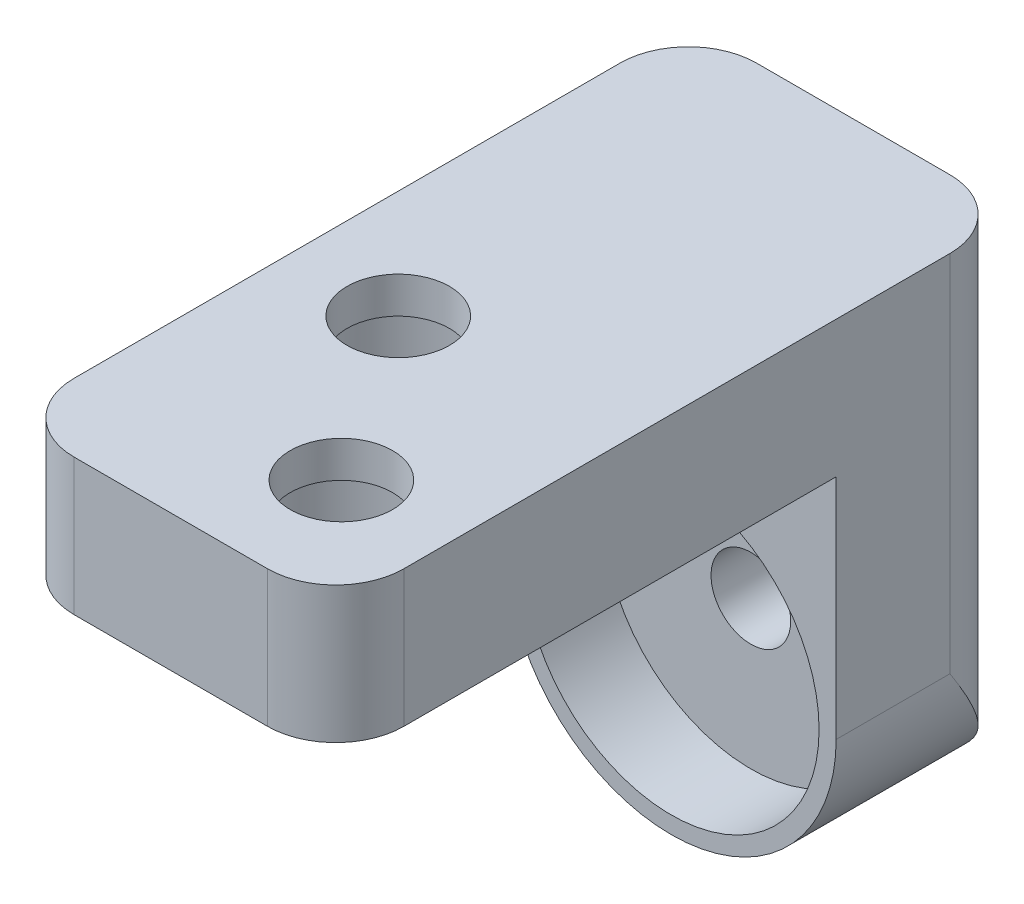
ISO-10303-21;
HEADER;
FILE_DESCRIPTION(('STEP AP214'),'2;1');
FILE_NAME('part.step','',(''),(''),'','','');
FILE_SCHEMA(('AUTOMOTIVE_DESIGN { 1 0 10303 214 1 1 1 1 }'));
ENDSEC;
DATA;
#1=APPLICATION_CONTEXT('core data for automotive mechanical design processes');
#2=APPLICATION_PROTOCOL_DEFINITION('international standard','automotive_design',2000,#1);
#3=PRODUCT_CONTEXT('',#1,'mechanical');
#4=PRODUCT('Part','Part','',(#3));
#5=PRODUCT_RELATED_PRODUCT_CATEGORY('part','',(#4));
#6=PRODUCT_DEFINITION_FORMATION('','',#4);
#7=PRODUCT_DEFINITION_CONTEXT('part definition',#1,'design');
#8=PRODUCT_DEFINITION('design','',#6,#7);
#9=PRODUCT_DEFINITION_SHAPE('','',#8);
#10=(LENGTH_UNIT() NAMED_UNIT(*) SI_UNIT(.MILLI.,.METRE.));
#11=(NAMED_UNIT(*) PLANE_ANGLE_UNIT() SI_UNIT($,.RADIAN.));
#12=(NAMED_UNIT(*) SI_UNIT($,.STERADIAN.) SOLID_ANGLE_UNIT());
#13=UNCERTAINTY_MEASURE_WITH_UNIT(LENGTH_MEASURE(1.E-05),#10,'distance_accuracy_value','');
#14=(GEOMETRIC_REPRESENTATION_CONTEXT(3) GLOBAL_UNCERTAINTY_ASSIGNED_CONTEXT((#13)) GLOBAL_UNIT_ASSIGNED_CONTEXT((#10,
#11,#12)) REPRESENTATION_CONTEXT('',''));
#15=CARTESIAN_POINT('',(0.,0.,0.));
#16=DIRECTION('',(0.,0.,1.));
#17=DIRECTION('',(1.,0.,0.));
#18=AXIS2_PLACEMENT_3D('',#15,#16,#17);
#19=CARTESIAN_POINT('',(0.,0.,30.));
#20=DIRECTION('',(1.,0.,0.));
#21=DIRECTION('',(0.,0.,-1.));
#22=AXIS2_PLACEMENT_3D('',#19,#20,#21);
#23=PLANE('',#22);
#24=DIRECTION('',(0.,0.,1.));
#25=VECTOR('',#24,1.);
#26=CARTESIAN_POINT('',(0.,17.25,30.));
#27=LINE('',#26,#25);
#28=CARTESIAN_POINT('',(0.,17.25,8.));
#29=VERTEX_POINT('',#28);
#30=CARTESIAN_POINT('',(0.,17.25,27.));
#31=VERTEX_POINT('',#30);
#32=EDGE_CURVE('E293',#29,#31,#27,.T.);
#33=ORIENTED_EDGE('',*,*,#32,.T.);
#34=DIRECTION('',(0.,1.,0.));
#35=VECTOR('',#34,1.);
#36=CARTESIAN_POINT('',(0.,0.,27.));
#37=LINE('',#36,#35);
#38=CARTESIAN_POINT('',(0.,23.25,27.));
#39=VERTEX_POINT('',#38);
#40=EDGE_CURVE('E57',#31,#39,#37,.T.);
#41=ORIENTED_EDGE('',*,*,#40,.T.);
#42=DIRECTION('',(0.,0.,-1.));
#43=VECTOR('',#42,1.);
#44=CARTESIAN_POINT('',(0.,23.25,30.));
#45=LINE('',#44,#43);
#46=CARTESIAN_POINT('',(0.,23.25,3.00000000000002));
#47=VERTEX_POINT('',#46);
#48=EDGE_CURVE('E161',#39,#47,#45,.T.);
#49=ORIENTED_EDGE('',*,*,#48,.T.);
#50=DIRECTION('',(0.,1.,0.));
#51=VECTOR('',#50,1.);
#52=CARTESIAN_POINT('',(0.,0.,3.00000000000002));
#53=LINE('',#52,#51);
#54=CARTESIAN_POINT('',(0.,7.25,3.00000000000002));
#55=VERTEX_POINT('',#54);
#56=EDGE_CURVE('E390',#55,#47,#53,.T.);
#57=ORIENTED_EDGE('',*,*,#56,.F.);
#58=DIRECTION('',(0.,0.,-1.));
#59=VECTOR('',#58,1.);
#60=CARTESIAN_POINT('',(0.,7.25,30.));
#61=LINE('',#60,#59);
#62=CARTESIAN_POINT('',(0.,7.25,8.));
#63=VERTEX_POINT('',#62);
#64=EDGE_CURVE('E194',#55,#63,#61,.F.);
#65=ORIENTED_EDGE('',*,*,#64,.T.);
#66=DIRECTION('',(0.,1.,0.));
#67=VECTOR('',#66,1.);
#68=CARTESIAN_POINT('',(0.,0.,8.));
#69=LINE('',#68,#67);
#70=EDGE_CURVE('E295',#63,#29,#69,.T.);
#71=ORIENTED_EDGE('',*,*,#70,.T.);
#72=EDGE_LOOP('',(#33,#41,#49,#57,#65,#71));
#73=FACE_BOUND('',#72,.T.);
#74=ADVANCED_FACE('F42',(#73),#23,.F.);
#75=CARTESIAN_POINT('',(14.5,0.,30.));
#76=DIRECTION('',(-1.,0.,0.));
#77=DIRECTION('',(0.,0.,1.));
#78=AXIS2_PLACEMENT_3D('',#75,#76,#77);
#79=PLANE('',#78);
#80=DIRECTION('',(0.,0.,-1.));
#81=VECTOR('',#80,1.);
#82=CARTESIAN_POINT('',(14.5,7.25,30.));
#83=LINE('',#82,#81);
#84=CARTESIAN_POINT('',(14.5,7.25,8.));
#85=VERTEX_POINT('',#84);
#86=CARTESIAN_POINT('',(14.5,7.25,3.00000000000002));
#87=VERTEX_POINT('',#86);
#88=EDGE_CURVE('E177',#85,#87,#83,.T.);
#89=ORIENTED_EDGE('',*,*,#88,.T.);
#90=DIRECTION('',(0.,1.,0.));
#91=VECTOR('',#90,1.);
#92=CARTESIAN_POINT('',(14.5,0.,3.00000000000002));
#93=LINE('',#92,#91);
#94=CARTESIAN_POINT('',(14.5,23.25,3.00000000000002));
#95=VERTEX_POINT('',#94);
#96=EDGE_CURVE('E316',#87,#95,#93,.T.);
#97=ORIENTED_EDGE('',*,*,#96,.T.);
#98=DIRECTION('',(0.,0.,-1.));
#99=VECTOR('',#98,1.);
#100=CARTESIAN_POINT('',(14.5,23.25,30.));
#101=LINE('',#100,#99);
#102=CARTESIAN_POINT('',(14.5,23.25,27.));
#103=VERTEX_POINT('',#102);
#104=EDGE_CURVE('E166',#103,#95,#101,.T.);
#105=ORIENTED_EDGE('',*,*,#104,.F.);
#106=DIRECTION('',(0.,1.,0.));
#107=VECTOR('',#106,1.);
#108=CARTESIAN_POINT('',(14.5,0.,27.));
#109=LINE('',#108,#107);
#110=CARTESIAN_POINT('',(14.5,17.25,27.));
#111=VERTEX_POINT('',#110);
#112=EDGE_CURVE('E140',#111,#103,#109,.T.);
#113=ORIENTED_EDGE('',*,*,#112,.F.);
#114=DIRECTION('',(0.,0.,1.));
#115=VECTOR('',#114,1.);
#116=CARTESIAN_POINT('',(14.5,17.25,30.));
#117=LINE('',#116,#115);
#118=CARTESIAN_POINT('',(14.5,17.25,8.));
#119=VERTEX_POINT('',#118);
#120=EDGE_CURVE('E303',#119,#111,#117,.T.);
#121=ORIENTED_EDGE('',*,*,#120,.F.);
#122=DIRECTION('',(0.,1.,0.));
#123=VECTOR('',#122,1.);
#124=CARTESIAN_POINT('',(14.5,0.,8.));
#125=LINE('',#124,#123);
#126=EDGE_CURVE('E202',#85,#119,#125,.T.);
#127=ORIENTED_EDGE('',*,*,#126,.F.);
#128=EDGE_LOOP('',(#89,#97,#105,#113,#121,#127));
#129=FACE_BOUND('',#128,.T.);
#130=ADVANCED_FACE('F283',(#129),#79,.F.);
#131=CARTESIAN_POINT('',(0.,23.25,30.));
#132=DIRECTION('',(0.,-1.,0.));
#133=DIRECTION('',(0.,0.,-1.));
#134=AXIS2_PLACEMENT_3D('',#131,#132,#133);
#135=PLANE('',#134);
#136=CARTESIAN_POINT('',(4.75,23.25,17.5));
#137=DIRECTION('',(0.,-1.,0.));
#138=DIRECTION('',(0.,0.,-1.));
#139=AXIS2_PLACEMENT_3D('',#136,#137,#138);
#140=CIRCLE('',#139,2.25);
#141=CARTESIAN_POINT('',(4.75,23.25,15.25));
#142=VERTEX_POINT('',#141);
#143=EDGE_CURVE('E352',#142,#142,#140,.T.);
#144=ORIENTED_EDGE('',*,*,#143,.T.);
#145=EDGE_LOOP('',(#144));
#146=FACE_BOUND('',#145,.T.);
#147=CARTESIAN_POINT('',(9.75,23.25,25.));
#148=DIRECTION('',(0.,-1.,0.));
#149=DIRECTION('',(0.,0.,-1.));
#150=AXIS2_PLACEMENT_3D('',#147,#148,#149);
#151=CIRCLE('',#150,2.25);
#152=CARTESIAN_POINT('',(9.75,23.25,22.75));
#153=VERTEX_POINT('',#152);
#154=EDGE_CURVE('E203',#153,#153,#151,.T.);
#155=ORIENTED_EDGE('',*,*,#154,.T.);
#156=EDGE_LOOP('',(#155));
#157=FACE_BOUND('',#156,.T.);
#158=CARTESIAN_POINT('',(3.,23.25,27.));
#159=DIRECTION('',(0.,1.,0.));
#160=DIRECTION('',(0.,0.,1.));
#161=AXIS2_PLACEMENT_3D('',#158,#159,#160);
#162=CIRCLE('',#161,3.);
#163=CARTESIAN_POINT('',(3.00000000000002,23.25,30.));
#164=VERTEX_POINT('',#163);
#165=EDGE_CURVE('E146',#39,#164,#162,.T.);
#166=ORIENTED_EDGE('',*,*,#165,.T.);
#167=DIRECTION('',(-1.,0.,0.));
#168=VECTOR('',#167,1.);
#169=CARTESIAN_POINT('',(0.,23.25,30.));
#170=LINE('',#169,#168);
#171=CARTESIAN_POINT('',(11.5,23.25,30.));
#172=VERTEX_POINT('',#171);
#173=EDGE_CURVE('E153',#172,#164,#170,.T.);
#174=ORIENTED_EDGE('',*,*,#173,.F.);
#175=CARTESIAN_POINT('',(11.5,23.25,27.));
#176=DIRECTION('',(0.,1.,0.));
#177=DIRECTION('',(0.,0.,1.));
#178=AXIS2_PLACEMENT_3D('',#175,#176,#177);
#179=CIRCLE('',#178,3.);
#180=EDGE_CURVE('E137',#172,#103,#179,.T.);
#181=ORIENTED_EDGE('',*,*,#180,.T.);
#182=ORIENTED_EDGE('',*,*,#104,.T.);
#183=CARTESIAN_POINT('',(11.5,23.25,3.));
#184=DIRECTION('',(0.,1.,0.));
#185=DIRECTION('',(0.,0.,-1.));
#186=AXIS2_PLACEMENT_3D('',#183,#184,#185);
#187=CIRCLE('',#186,3.);
#188=CARTESIAN_POINT('',(11.5,23.25,0.));
#189=VERTEX_POINT('',#188);
#190=EDGE_CURVE('E145',#95,#189,#187,.T.);
#191=ORIENTED_EDGE('',*,*,#190,.T.);
#192=DIRECTION('',(-1.,0.,0.));
#193=VECTOR('',#192,1.);
#194=CARTESIAN_POINT('',(0.,23.25,0.));
#195=LINE('',#194,#193);
#196=CARTESIAN_POINT('',(3.00000000000002,23.25,0.));
#197=VERTEX_POINT('',#196);
#198=EDGE_CURVE('E162',#189,#197,#195,.T.);
#199=ORIENTED_EDGE('',*,*,#198,.T.);
#200=CARTESIAN_POINT('',(3.,23.25,3.));
#201=DIRECTION('',(0.,1.,0.));
#202=DIRECTION('',(0.,0.,1.));
#203=AXIS2_PLACEMENT_3D('',#200,#201,#202);
#204=CIRCLE('',#203,3.);
#205=EDGE_CURVE('E324',#197,#47,#204,.T.);
#206=ORIENTED_EDGE('',*,*,#205,.T.);
#207=ORIENTED_EDGE('',*,*,#48,.F.);
#208=EDGE_LOOP('',(#166,#174,#181,#182,#191,#199,#206,#207));
#209=FACE_BOUND('',#208,.T.);
#210=ADVANCED_FACE('F159',(#146,#157,#209),#135,.F.);
#211=CARTESIAN_POINT('',(0.,0.,30.));
#212=DIRECTION('',(0.,0.,-1.));
#213=DIRECTION('',(-1.,0.,0.));
#214=AXIS2_PLACEMENT_3D('',#211,#212,#213);
#215=PLANE('',#214);
#216=DIRECTION('',(0.,1.,0.));
#217=VECTOR('',#216,1.);
#218=CARTESIAN_POINT('',(3.00000000000002,0.,30.));
#219=LINE('',#218,#217);
#220=CARTESIAN_POINT('',(3.00000000000002,17.25,30.));
#221=VERTEX_POINT('',#220);
#222=EDGE_CURVE('E156',#221,#164,#219,.T.);
#223=ORIENTED_EDGE('',*,*,#222,.F.);
#224=DIRECTION('',(1.,0.,0.));
#225=VECTOR('',#224,1.);
#226=CARTESIAN_POINT('',(0.,17.25,30.));
#227=LINE('',#226,#225);
#228=CARTESIAN_POINT('',(11.5,17.25,30.));
#229=VERTEX_POINT('',#228);
#230=EDGE_CURVE('E155',#221,#229,#227,.T.);
#231=ORIENTED_EDGE('',*,*,#230,.T.);
#232=DIRECTION('',(0.,1.,0.));
#233=VECTOR('',#232,1.);
#234=CARTESIAN_POINT('',(11.5,0.,30.));
#235=LINE('',#234,#233);
#236=EDGE_CURVE('E65',#229,#172,#235,.T.);
#237=ORIENTED_EDGE('',*,*,#236,.T.);
#238=ORIENTED_EDGE('',*,*,#173,.T.);
#239=EDGE_LOOP('',(#223,#231,#237,#238));
#240=FACE_BOUND('',#239,.T.);
#241=ADVANCED_FACE('F152',(#240),#215,.F.);
#242=CARTESIAN_POINT('',(0.,0.,0.));
#243=DIRECTION('',(0.,0.,-1.));
#244=DIRECTION('',(-1.,0.,0.));
#245=AXIS2_PLACEMENT_3D('',#242,#243,#244);
#246=PLANE('',#245);
#247=CARTESIAN_POINT('',(7.25,7.25,0.));
#248=DIRECTION('',(0.,0.,-1.));
#249=DIRECTION('',(-1.,0.,0.));
#250=AXIS2_PLACEMENT_3D('',#247,#248,#249);
#251=CIRCLE('',#250,1.75);
#252=CARTESIAN_POINT('',(5.5,7.25,0.));
#253=VERTEX_POINT('',#252);
#254=EDGE_CURVE('E329',#253,#253,#251,.T.);
#255=ORIENTED_EDGE('',*,*,#254,.F.);
#256=EDGE_LOOP('',(#255));
#257=FACE_BOUND('',#256,.T.);
#258=CARTESIAN_POINT('',(7.25,7.25,0.));
#259=DIRECTION('',(0.,0.,-1.));
#260=DIRECTION('',(-1.,0.,0.));
#261=AXIS2_PLACEMENT_3D('',#258,#259,#260);
#262=CIRCLE('',#261,7.25);
#263=CARTESIAN_POINT('',(7.25,0.,0.));
#264=VERTEX_POINT('',#263);
#265=CARTESIAN_POINT('',(3.00000000000002,1.37632993776462,0.));
#266=VERTEX_POINT('',#265);
#267=EDGE_CURVE('E181',#264,#266,#262,.T.);
#268=ORIENTED_EDGE('',*,*,#267,.T.);
#269=DIRECTION('',(0.,1.,0.));
#270=VECTOR('',#269,1.);
#271=CARTESIAN_POINT('',(3.00000000000002,0.,0.));
#272=LINE('',#271,#270);
#273=EDGE_CURVE('E391',#266,#197,#272,.T.);
#274=ORIENTED_EDGE('',*,*,#273,.T.);
#275=ORIENTED_EDGE('',*,*,#198,.F.);
#276=DIRECTION('',(0.,1.,0.));
#277=VECTOR('',#276,1.);
#278=CARTESIAN_POINT('',(11.5,0.,0.));
#279=LINE('',#278,#277);
#280=CARTESIAN_POINT('',(11.5,1.37632993776462,0.));
#281=VERTEX_POINT('',#280);
#282=EDGE_CURVE('E319',#281,#189,#279,.T.);
#283=ORIENTED_EDGE('',*,*,#282,.F.);
#284=CARTESIAN_POINT('',(7.25,7.25,0.));
#285=DIRECTION('',(0.,0.,-1.));
#286=DIRECTION('',(-1.,0.,0.));
#287=AXIS2_PLACEMENT_3D('',#284,#285,#286);
#288=CIRCLE('',#287,7.25);
#289=EDGE_CURVE('E185',#281,#264,#288,.T.);
#290=ORIENTED_EDGE('',*,*,#289,.T.);
#291=EDGE_LOOP('',(#268,#274,#275,#283,#290));
#292=FACE_BOUND('',#291,.T.);
#293=ADVANCED_FACE('F271',(#257,#292),#246,.T.);
#294=CARTESIAN_POINT('',(0.,17.25,30.));
#295=DIRECTION('',(0.,1.,0.));
#296=DIRECTION('',(0.,0.,1.));
#297=AXIS2_PLACEMENT_3D('',#294,#295,#296);
#298=PLANE('',#297);
#299=CARTESIAN_POINT('',(4.75,17.25,17.5));
#300=DIRECTION('',(0.,-1.,0.));
#301=DIRECTION('',(0.,0.,-1.));
#302=AXIS2_PLACEMENT_3D('',#299,#300,#301);
#303=CIRCLE('',#302,3.99999999999999);
#304=CARTESIAN_POINT('',(4.75,17.25,13.5));
#305=VERTEX_POINT('',#304);
#306=EDGE_CURVE('E338',#305,#305,#303,.T.);
#307=ORIENTED_EDGE('',*,*,#306,.F.);
#308=EDGE_LOOP('',(#307));
#309=FACE_BOUND('',#308,.T.);
#310=CARTESIAN_POINT('',(9.75,17.25,25.));
#311=DIRECTION('',(0.,-1.,0.));
#312=DIRECTION('',(0.,0.,-1.));
#313=AXIS2_PLACEMENT_3D('',#310,#311,#312);
#314=CIRCLE('',#313,3.99999999999999);
#315=CARTESIAN_POINT('',(9.75,17.25,21.));
#316=VERTEX_POINT('',#315);
#317=EDGE_CURVE('E356',#316,#316,#314,.T.);
#318=ORIENTED_EDGE('',*,*,#317,.F.);
#319=EDGE_LOOP('',(#318));
#320=FACE_BOUND('',#319,.T.);
#321=CARTESIAN_POINT('',(3.,17.25,27.));
#322=DIRECTION('',(0.,1.,0.));
#323=DIRECTION('',(0.,0.,1.));
#324=AXIS2_PLACEMENT_3D('',#321,#322,#323);
#325=CIRCLE('',#324,3.);
#326=EDGE_CURVE('E12',#31,#221,#325,.T.);
#327=ORIENTED_EDGE('',*,*,#326,.F.);
#328=ORIENTED_EDGE('',*,*,#32,.F.);
#329=DIRECTION('',(1.,0.,0.));
#330=VECTOR('',#329,1.);
#331=CARTESIAN_POINT('',(0.,17.25,8.));
#332=LINE('',#331,#330);
#333=EDGE_CURVE('E172',#29,#119,#332,.T.);
#334=ORIENTED_EDGE('',*,*,#333,.T.);
#335=ORIENTED_EDGE('',*,*,#120,.T.);
#336=CARTESIAN_POINT('',(11.5,17.25,27.));
#337=DIRECTION('',(0.,1.,0.));
#338=DIRECTION('',(0.,0.,1.));
#339=AXIS2_PLACEMENT_3D('',#336,#337,#338);
#340=CIRCLE('',#339,3.);
#341=EDGE_CURVE('E51',#229,#111,#340,.T.);
#342=ORIENTED_EDGE('',*,*,#341,.F.);
#343=ORIENTED_EDGE('',*,*,#230,.F.);
#344=EDGE_LOOP('',(#327,#328,#334,#335,#342,#343));
#345=FACE_BOUND('',#344,.T.);
#346=ADVANCED_FACE('F268',(#309,#320,#345),#298,.F.);
#347=CARTESIAN_POINT('',(7.25,7.25,30.));
#348=DIRECTION('',(0.,0.,-1.));
#349=DIRECTION('',(-1.,0.,0.));
#350=AXIS2_PLACEMENT_3D('',#347,#348,#349);
#351=CYLINDRICAL_SURFACE('',#350,7.25);
#352=ORIENTED_EDGE('',*,*,#64,.F.);
#353=CARTESIAN_POINT('',(3.00000000000002,1.37632993776462,0.));
#354=CARTESIAN_POINT('',(2.89591982684832,1.45160870138263,9.162518016514E-06));
#355=CARTESIAN_POINT('',(2.79395457545911,1.52962992745668,0.0054131786161603));
#356=CARTESIAN_POINT('',(2.59503895116905,1.69031858975189,0.0257786400479943));
#357=CARTESIAN_POINT('',(2.49807974174803,1.77297726131148,0.0407225756123809));
#358=CARTESIAN_POINT('',(2.31051760017862,1.94153640530576,0.0787535877769015));
#359=CARTESIAN_POINT('',(2.21986083852864,2.02739623524203,0.101757809943099));
#360=CARTESIAN_POINT('',(2.04408526561195,2.20258912774733,0.154888041346703));
#361=CARTESIAN_POINT('',(1.95896985575951,2.29192427079632,0.185018373166622));
#362=CARTESIAN_POINT('',(1.76277070939508,2.50852165777609,0.264242507756319));
#363=CARTESIAN_POINT('',(1.65431670747718,2.63713531244464,0.316169965848219));
#364=CARTESIAN_POINT('',(1.44847604355413,2.89884399740552,0.429670714273584));
#365=CARTESIAN_POINT('',(1.35109180660378,3.03194000140029,0.491246111182255));
#366=CARTESIAN_POINT('',(1.16671099590255,3.30246442155011,0.622620135420923));
#367=CARTESIAN_POINT('',(1.07977537759907,3.43991285853072,0.692462704928858));
#368=CARTESIAN_POINT('',(0.91663472251387,3.71772787339079,0.838614839362562));
#369=CARTESIAN_POINT('',(0.840432895930939,3.8580953099237,0.914926328090325));
#370=CARTESIAN_POINT('',(0.669154565981333,4.19958703589873,1.10536003329063));
#371=CARTESIAN_POINT('',(0.57927037922259,4.40187423230509,1.22208749149714));
#372=CARTESIAN_POINT('',(0.419479171943423,4.8098144736709,1.4631736116216));
#373=CARTESIAN_POINT('',(0.349581859692521,5.01546910319969,1.58753594654202));
#374=CARTESIAN_POINT('',(0.22920992354904,5.42867562738165,1.8413744883116));
#375=CARTESIAN_POINT('',(0.178698215011715,5.63622311403943,1.97084040326089));
#376=CARTESIAN_POINT('',(0.0963982818274475,6.05270585488316,2.23319749052373));
#377=CARTESIAN_POINT('',(0.064600436867528,6.26164034008405,2.36608686618536));
#378=CARTESIAN_POINT('',(0.0282193993449974,6.59824881094579,2.58127360071956));
#379=CARTESIAN_POINT('',(0.0178549787053837,6.72569749323333,2.66299978638623));
#380=CARTESIAN_POINT('',(0.00388079411592098,6.98066217243889,2.82674847638176));
#381=CARTESIAN_POINT('',(0.000265998734258639,7.10817804828074,2.90877071428506));
#382=CARTESIAN_POINT('',(4.71610640371123E-06,7.24045196950277,2.99385806213614));
#383=CARTESIAN_POINT('',(7.70922000559737E-10,7.24522599852038,2.99692904002514));
#384=CARTESIAN_POINT('',(0.,7.25,3.));
#385=B_SPLINE_CURVE_WITH_KNOTS('',3,(#353,#354,#355,#356,#357,#358,#359,#360,#361,#362,#363,
#364,#365,#366,#367,#368,#369,#370,#371,#372,#373,#374,#375,#376,#377,#378,#379,#380,#381,#382,
#383,#384),.UNSPECIFIED.,.F.,.F.,(4,2,2,2,2,2,2,2,2,2,2,2,2,2,2,4),(0.,0.385039583164543,
0.769374480519024,1.14986927816782,1.53059547242627,2.05800999114305,2.58553982885391,
3.1160114482753,3.64664138267959,4.39629968067136,5.14632149571802,5.89490128154947,
6.64309590498027,7.09823672147681,7.55303812274127,7.57006751498342),.UNSPECIFIED.);
#386=EDGE_CURVE('E211',#55,#266,#385,.F.);
#387=ORIENTED_EDGE('',*,*,#386,.T.);
#388=ORIENTED_EDGE('',*,*,#267,.F.);
#389=DIRECTION('',(0.,0.,-1.));
#390=VECTOR('',#389,1.);
#391=CARTESIAN_POINT('',(7.25,0.,30.));
#392=LINE('',#391,#390);
#393=CARTESIAN_POINT('',(7.25,0.,8.));
#394=VERTEX_POINT('',#393);
#395=EDGE_CURVE('E198',#394,#264,#392,.T.);
#396=ORIENTED_EDGE('',*,*,#395,.F.);
#397=CARTESIAN_POINT('',(7.25,7.25,8.));
#398=DIRECTION('',(0.,0.,-1.));
#399=DIRECTION('',(-1.,0.,0.));
#400=AXIS2_PLACEMENT_3D('',#397,#398,#399);
#401=CIRCLE('',#400,7.25);
#402=EDGE_CURVE('E188',#63,#394,#401,.F.);
#403=ORIENTED_EDGE('',*,*,#402,.F.);
#404=EDGE_LOOP('',(#352,#387,#388,#396,#403));
#405=FACE_BOUND('',#404,.T.);
#406=ADVANCED_FACE('F44',(#405),#351,.T.);
#407=CARTESIAN_POINT('',(7.25,7.25,30.));
#408=DIRECTION('',(0.,0.,-1.));
#409=DIRECTION('',(-1.,0.,0.));
#410=AXIS2_PLACEMENT_3D('',#407,#408,#409);
#411=CYLINDRICAL_SURFACE('',#410,7.25);
#412=ORIENTED_EDGE('',*,*,#289,.F.);
#413=CARTESIAN_POINT('',(11.5,1.37632993776462,0.));
#414=CARTESIAN_POINT('',(11.6040801731517,1.45160870138263,9.16251801575254E-06));
#415=CARTESIAN_POINT('',(11.7060454245409,1.52962992745668,0.00541317861615954));
#416=CARTESIAN_POINT('',(11.904961048831,1.69031858975189,0.0257786400479937));
#417=CARTESIAN_POINT('',(12.001920258252,1.77297726131148,0.0407225756123805));
#418=CARTESIAN_POINT('',(12.1894823998214,1.94153640530576,0.0787535877769011));
#419=CARTESIAN_POINT('',(12.2801391614714,2.02739623524203,0.101757809943099));
#420=CARTESIAN_POINT('',(12.4559147343881,2.20258912774733,0.154888041346703));
#421=CARTESIAN_POINT('',(12.5410301442405,2.29192427079632,0.185018373166622));
#422=CARTESIAN_POINT('',(12.7372292906049,2.5085216577761,0.26424250775632));
#423=CARTESIAN_POINT('',(12.8456832925228,2.63713531244464,0.316169965848221));
#424=CARTESIAN_POINT('',(13.0515239564459,2.89884399740552,0.429670714273586));
#425=CARTESIAN_POINT('',(13.1489081933962,3.03194000140029,0.491246111182257));
#426=CARTESIAN_POINT('',(13.3332890040975,3.30246442155011,0.622620135420925));
#427=CARTESIAN_POINT('',(13.4202246224009,3.43991285853073,0.69246270492886));
#428=CARTESIAN_POINT('',(13.5833652774861,3.7177278733908,0.838614839362564));
#429=CARTESIAN_POINT('',(13.6595671040691,3.85809530992371,0.914926328090327));
#430=CARTESIAN_POINT('',(13.8308454340187,4.19958703589874,1.10536003329063));
#431=CARTESIAN_POINT('',(13.9207296207774,4.40187423230509,1.22208749149714));
#432=CARTESIAN_POINT('',(14.0805208280566,4.80981447367091,1.4631736116216));
#433=CARTESIAN_POINT('',(14.1504181403075,5.01546910319969,1.58753594654202));
#434=CARTESIAN_POINT('',(14.270790076451,5.42867562738165,1.8413744883116));
#435=CARTESIAN_POINT('',(14.3213017849883,5.63622311403944,1.97084040326089));
#436=CARTESIAN_POINT('',(14.4036017181726,6.05270585488317,2.23319749052372));
#437=CARTESIAN_POINT('',(14.4353995631325,6.26164034008406,2.36608686618535));
#438=CARTESIAN_POINT('',(14.471780600655,6.59824881094579,2.58127360071956));
#439=CARTESIAN_POINT('',(14.4821450212946,6.72569749323332,2.66299978638625));
#440=CARTESIAN_POINT('',(14.4961192058841,6.9806621724389,2.82674847638175));
#441=CARTESIAN_POINT('',(14.4997340012657,7.10817804828077,2.90877071428501));
#442=CARTESIAN_POINT('',(14.4999952838936,7.24045196950277,2.99385806213614));
#443=CARTESIAN_POINT('',(14.4999999992291,7.24522599852038,2.99692904002514));
#444=CARTESIAN_POINT('',(14.5,7.25,3.));
#445=B_SPLINE_CURVE_WITH_KNOTS('',3,(#413,#414,#415,#416,#417,#418,#419,#420,#421,#422,#423,
#424,#425,#426,#427,#428,#429,#430,#431,#432,#433,#434,#435,#436,#437,#438,#439,#440,#441,#442,
#443,#444),.UNSPECIFIED.,.F.,.F.,(4,2,2,2,2,2,2,2,2,2,2,2,2,2,2,4),(0.,0.385039583164542,
0.769374480519022,1.14986927816782,1.53059547242627,2.05800999114305,2.58553982885392,
3.1160114482753,3.6466413826796,4.39629968067137,5.14632149571803,5.89490128154948,
6.64309590498027,7.09823672147681,7.55303812274127,7.57006751498342),.UNSPECIFIED.);
#446=EDGE_CURVE('E197',#281,#87,#445,.T.);
#447=ORIENTED_EDGE('',*,*,#446,.T.);
#448=ORIENTED_EDGE('',*,*,#88,.F.);
#449=CARTESIAN_POINT('',(7.25,7.25,8.));
#450=DIRECTION('',(0.,0.,-1.));
#451=DIRECTION('',(-1.,0.,0.));
#452=AXIS2_PLACEMENT_3D('',#449,#450,#451);
#453=CIRCLE('',#452,7.25);
#454=EDGE_CURVE('E191',#394,#85,#453,.F.);
#455=ORIENTED_EDGE('',*,*,#454,.F.);
#456=ORIENTED_EDGE('',*,*,#395,.T.);
#457=EDGE_LOOP('',(#412,#447,#448,#455,#456));
#458=FACE_BOUND('',#457,.T.);
#459=ADVANCED_FACE('F216',(#458),#411,.T.);
#460=CARTESIAN_POINT('',(0.,0.,8.));
#461=DIRECTION('',(0.,0.,-1.));
#462=DIRECTION('',(-1.,0.,0.));
#463=AXIS2_PLACEMENT_3D('',#460,#461,#462);
#464=PLANE('',#463);
#465=CARTESIAN_POINT('',(7.25,7.25,8.));
#466=DIRECTION('',(0.,0.,1.));
#467=DIRECTION('',(1.,0.,0.));
#468=AXIS2_PLACEMENT_3D('',#465,#466,#467);
#469=CIRCLE('',#468,6.5);
#470=CARTESIAN_POINT('',(13.75,7.25,8.));
#471=VERTEX_POINT('',#470);
#472=EDGE_CURVE('E333',#471,#471,#469,.T.);
#473=ORIENTED_EDGE('',*,*,#472,.F.);
#474=EDGE_LOOP('',(#473));
#475=FACE_BOUND('',#474,.T.);
#476=ORIENTED_EDGE('',*,*,#402,.T.);
#477=ORIENTED_EDGE('',*,*,#454,.T.);
#478=ORIENTED_EDGE('',*,*,#126,.T.);
#479=ORIENTED_EDGE('',*,*,#333,.F.);
#480=ORIENTED_EDGE('',*,*,#70,.F.);
#481=EDGE_LOOP('',(#476,#477,#478,#479,#480));
#482=FACE_BOUND('',#481,.T.);
#483=ADVANCED_FACE('F266',(#475,#482),#464,.F.);
#484=CARTESIAN_POINT('',(9.75,17.25,25.));
#485=DIRECTION('',(0.,-1.,0.));
#486=DIRECTION('',(0.,0.,-1.));
#487=AXIS2_PLACEMENT_3D('',#484,#485,#486);
#488=CYLINDRICAL_SURFACE('',#487,2.25000000000001);
#489=ORIENTED_EDGE('',*,*,#154,.F.);
#490=EDGE_LOOP('',(#489));
#491=FACE_BOUND('',#490,.T.);
#492=CARTESIAN_POINT('',(9.75,21.65,25.));
#493=DIRECTION('',(0.,-1.,0.));
#494=DIRECTION('',(0.,0.,-1.));
#495=AXIS2_PLACEMENT_3D('',#492,#493,#494);
#496=CIRCLE('',#495,2.25000000000001);
#497=CARTESIAN_POINT('',(9.75,21.65,22.75));
#498=VERTEX_POINT('',#497);
#499=EDGE_CURVE('E364',#498,#498,#496,.T.);
#500=ORIENTED_EDGE('',*,*,#499,.T.);
#501=EDGE_LOOP('',(#500));
#502=FACE_BOUND('',#501,.T.);
#503=ADVANCED_FACE('F262',(#491,#502),#488,.F.);
#504=CARTESIAN_POINT('',(12.,21.65,25.));
#505=DIRECTION('',(0.,1.,0.));
#506=DIRECTION('',(0.,0.,1.));
#507=AXIS2_PLACEMENT_3D('',#504,#505,#506);
#508=PLANE('',#507);
#509=ORIENTED_EDGE('',*,*,#499,.F.);
#510=EDGE_LOOP('',(#509));
#511=FACE_BOUND('',#510,.T.);
#512=CARTESIAN_POINT('',(9.75,21.65,25.));
#513=DIRECTION('',(0.,-1.,0.));
#514=DIRECTION('',(0.,0.,-1.));
#515=AXIS2_PLACEMENT_3D('',#512,#513,#514);
#516=CIRCLE('',#515,3.99999999999999);
#517=CARTESIAN_POINT('',(9.75,21.65,21.));
#518=VERTEX_POINT('',#517);
#519=EDGE_CURVE('E360',#518,#518,#516,.T.);
#520=ORIENTED_EDGE('',*,*,#519,.T.);
#521=EDGE_LOOP('',(#520));
#522=FACE_BOUND('',#521,.T.);
#523=ADVANCED_FACE('F258',(#511,#522),#508,.F.);
#524=CARTESIAN_POINT('',(9.75,17.25,25.));
#525=DIRECTION('',(0.,-1.,0.));
#526=DIRECTION('',(0.,0.,-1.));
#527=AXIS2_PLACEMENT_3D('',#524,#525,#526);
#528=CYLINDRICAL_SURFACE('',#527,3.99999999999999);
#529=ORIENTED_EDGE('',*,*,#519,.F.);
#530=EDGE_LOOP('',(#529));
#531=FACE_BOUND('',#530,.T.);
#532=ORIENTED_EDGE('',*,*,#317,.T.);
#533=EDGE_LOOP('',(#532));
#534=FACE_BOUND('',#533,.T.);
#535=ADVANCED_FACE('F254',(#531,#534),#528,.F.);
#536=CARTESIAN_POINT('',(4.75,17.25,17.5));
#537=DIRECTION('',(0.,-1.,0.));
#538=DIRECTION('',(0.,0.,-1.));
#539=AXIS2_PLACEMENT_3D('',#536,#537,#538);
#540=CYLINDRICAL_SURFACE('',#539,2.25000000000001);
#541=ORIENTED_EDGE('',*,*,#143,.F.);
#542=EDGE_LOOP('',(#541));
#543=FACE_BOUND('',#542,.T.);
#544=CARTESIAN_POINT('',(4.75,21.65,17.5));
#545=DIRECTION('',(0.,-1.,0.));
#546=DIRECTION('',(0.,0.,-1.));
#547=AXIS2_PLACEMENT_3D('',#544,#545,#546);
#548=CIRCLE('',#547,2.25000000000001);
#549=CARTESIAN_POINT('',(4.75,21.65,15.25));
#550=VERTEX_POINT('',#549);
#551=EDGE_CURVE('E348',#550,#550,#548,.T.);
#552=ORIENTED_EDGE('',*,*,#551,.T.);
#553=EDGE_LOOP('',(#552));
#554=FACE_BOUND('',#553,.T.);
#555=ADVANCED_FACE('F250',(#543,#554),#540,.F.);
#556=CARTESIAN_POINT('',(7.00000000000001,21.65,17.5));
#557=DIRECTION('',(0.,1.,0.));
#558=DIRECTION('',(0.,0.,1.));
#559=AXIS2_PLACEMENT_3D('',#556,#557,#558);
#560=PLANE('',#559);
#561=ORIENTED_EDGE('',*,*,#551,.F.);
#562=EDGE_LOOP('',(#561));
#563=FACE_BOUND('',#562,.T.);
#564=CARTESIAN_POINT('',(4.75,21.65,17.5));
#565=DIRECTION('',(0.,-1.,0.));
#566=DIRECTION('',(0.,0.,-1.));
#567=AXIS2_PLACEMENT_3D('',#564,#565,#566);
#568=CIRCLE('',#567,3.99999999999999);
#569=CARTESIAN_POINT('',(4.75,21.65,13.5));
#570=VERTEX_POINT('',#569);
#571=EDGE_CURVE('E344',#570,#570,#568,.T.);
#572=ORIENTED_EDGE('',*,*,#571,.T.);
#573=EDGE_LOOP('',(#572));
#574=FACE_BOUND('',#573,.T.);
#575=ADVANCED_FACE('F246',(#563,#574),#560,.F.);
#576=CARTESIAN_POINT('',(4.75,17.25,17.5));
#577=DIRECTION('',(0.,-1.,0.));
#578=DIRECTION('',(0.,0.,-1.));
#579=AXIS2_PLACEMENT_3D('',#576,#577,#578);
#580=CYLINDRICAL_SURFACE('',#579,3.99999999999999);
#581=ORIENTED_EDGE('',*,*,#571,.F.);
#582=EDGE_LOOP('',(#581));
#583=FACE_BOUND('',#582,.T.);
#584=ORIENTED_EDGE('',*,*,#306,.T.);
#585=EDGE_LOOP('',(#584));
#586=FACE_BOUND('',#585,.T.);
#587=ADVANCED_FACE('F242',(#583,#586),#580,.F.);
#588=CARTESIAN_POINT('',(7.25,7.25,4.5));
#589=DIRECTION('',(0.,0.,1.));
#590=DIRECTION('',(1.,0.,0.));
#591=AXIS2_PLACEMENT_3D('',#588,#589,#590);
#592=CYLINDRICAL_SURFACE('',#591,6.5);
#593=CARTESIAN_POINT('',(7.25,7.25,4.5));
#594=DIRECTION('',(0.,0.,1.));
#595=DIRECTION('',(1.,0.,0.));
#596=AXIS2_PLACEMENT_3D('',#593,#594,#595);
#597=CIRCLE('',#596,6.5);
#598=CARTESIAN_POINT('',(13.75,7.25,4.5));
#599=VERTEX_POINT('',#598);
#600=EDGE_CURVE('E334',#599,#599,#597,.T.);
#601=ORIENTED_EDGE('',*,*,#600,.F.);
#602=EDGE_LOOP('',(#601));
#603=FACE_BOUND('',#602,.T.);
#604=ORIENTED_EDGE('',*,*,#472,.T.);
#605=EDGE_LOOP('',(#604));
#606=FACE_BOUND('',#605,.T.);
#607=ADVANCED_FACE('F238',(#603,#606),#592,.F.);
#608=CARTESIAN_POINT('',(7.25,7.25,4.5));
#609=DIRECTION('',(0.,0.,1.));
#610=DIRECTION('',(1.,0.,0.));
#611=AXIS2_PLACEMENT_3D('',#608,#609,#610);
#612=PLANE('',#611);
#613=CARTESIAN_POINT('',(7.25,7.25,4.5));
#614=DIRECTION('',(0.,0.,1.));
#615=DIRECTION('',(1.,0.,0.));
#616=AXIS2_PLACEMENT_3D('',#613,#614,#615);
#617=CIRCLE('',#616,1.75);
#618=CARTESIAN_POINT('',(9.,7.25,4.5));
#619=VERTEX_POINT('',#618);
#620=EDGE_CURVE('E325',#619,#619,#617,.T.);
#621=ORIENTED_EDGE('',*,*,#620,.F.);
#622=EDGE_LOOP('',(#621));
#623=FACE_BOUND('',#622,.T.);
#624=ORIENTED_EDGE('',*,*,#600,.T.);
#625=EDGE_LOOP('',(#624));
#626=FACE_BOUND('',#625,.T.);
#627=ADVANCED_FACE('F234',(#623,#626),#612,.T.);
#628=CARTESIAN_POINT('',(7.25,7.25,-0.999999999999999));
#629=DIRECTION('',(0.,0.,1.));
#630=DIRECTION('',(1.,0.,0.));
#631=AXIS2_PLACEMENT_3D('',#628,#629,#630);
#632=CYLINDRICAL_SURFACE('',#631,1.75);
#633=ORIENTED_EDGE('',*,*,#254,.T.);
#634=EDGE_LOOP('',(#633));
#635=FACE_BOUND('',#634,.T.);
#636=ORIENTED_EDGE('',*,*,#620,.T.);
#637=EDGE_LOOP('',(#636));
#638=FACE_BOUND('',#637,.T.);
#639=ADVANCED_FACE('F224',(#635,#638),#632,.F.);
#640=CARTESIAN_POINT('',(11.5,0.,3.));
#641=DIRECTION('',(0.,1.,0.));
#642=DIRECTION('',(0.,0.,1.));
#643=AXIS2_PLACEMENT_3D('',#640,#641,#642);
#644=CYLINDRICAL_SURFACE('',#643,3.);
#645=ORIENTED_EDGE('',*,*,#282,.T.);
#646=ORIENTED_EDGE('',*,*,#190,.F.);
#647=ORIENTED_EDGE('',*,*,#96,.F.);
#648=ORIENTED_EDGE('',*,*,#446,.F.);
#649=EDGE_LOOP('',(#645,#646,#647,#648));
#650=FACE_BOUND('',#649,.T.);
#651=ADVANCED_FACE('F219',(#650),#644,.T.);
#652=CARTESIAN_POINT('',(3.,0.,3.));
#653=DIRECTION('',(0.,1.,0.));
#654=DIRECTION('',(0.,0.,1.));
#655=AXIS2_PLACEMENT_3D('',#652,#653,#654);
#656=CYLINDRICAL_SURFACE('',#655,3.);
#657=ORIENTED_EDGE('',*,*,#56,.T.);
#658=ORIENTED_EDGE('',*,*,#205,.F.);
#659=ORIENTED_EDGE('',*,*,#273,.F.);
#660=ORIENTED_EDGE('',*,*,#386,.F.);
#661=EDGE_LOOP('',(#657,#658,#659,#660));
#662=FACE_BOUND('',#661,.T.);
#663=ADVANCED_FACE('F223',(#662),#656,.T.);
#664=CARTESIAN_POINT('',(11.5,0.,27.));
#665=DIRECTION('',(0.,1.,0.));
#666=DIRECTION('',(0.,0.,1.));
#667=AXIS2_PLACEMENT_3D('',#664,#665,#666);
#668=CYLINDRICAL_SURFACE('',#667,3.);
#669=ORIENTED_EDGE('',*,*,#341,.T.);
#670=ORIENTED_EDGE('',*,*,#112,.T.);
#671=ORIENTED_EDGE('',*,*,#180,.F.);
#672=ORIENTED_EDGE('',*,*,#236,.F.);
#673=EDGE_LOOP('',(#669,#670,#671,#672));
#674=FACE_BOUND('',#673,.T.);
#675=ADVANCED_FACE('F138',(#674),#668,.T.);
#676=CARTESIAN_POINT('',(3.,0.,27.));
#677=DIRECTION('',(0.,1.,0.));
#678=DIRECTION('',(0.,0.,1.));
#679=AXIS2_PLACEMENT_3D('',#676,#677,#678);
#680=CYLINDRICAL_SURFACE('',#679,3.);
#681=ORIENTED_EDGE('',*,*,#326,.T.);
#682=ORIENTED_EDGE('',*,*,#222,.T.);
#683=ORIENTED_EDGE('',*,*,#165,.F.);
#684=ORIENTED_EDGE('',*,*,#40,.F.);
#685=EDGE_LOOP('',(#681,#682,#683,#684));
#686=FACE_BOUND('',#685,.T.);
#687=ADVANCED_FACE('F229',(#686),#680,.T.);
#688=CLOSED_SHELL('',(#74,#130,#210,#241,#293,#346,#406,#459,#483,#503,#523,#535,#555,#575,#587,
#607,#627,#639,#651,#663,#675,#687));
#689=MANIFOLD_SOLID_BREP('B2',#688);
#690=ADVANCED_BREP_SHAPE_REPRESENTATION('',(#18,#689),#14);
#691=SHAPE_DEFINITION_REPRESENTATION(#9,#690);
ENDSEC;
END-ISO-10303-21;
